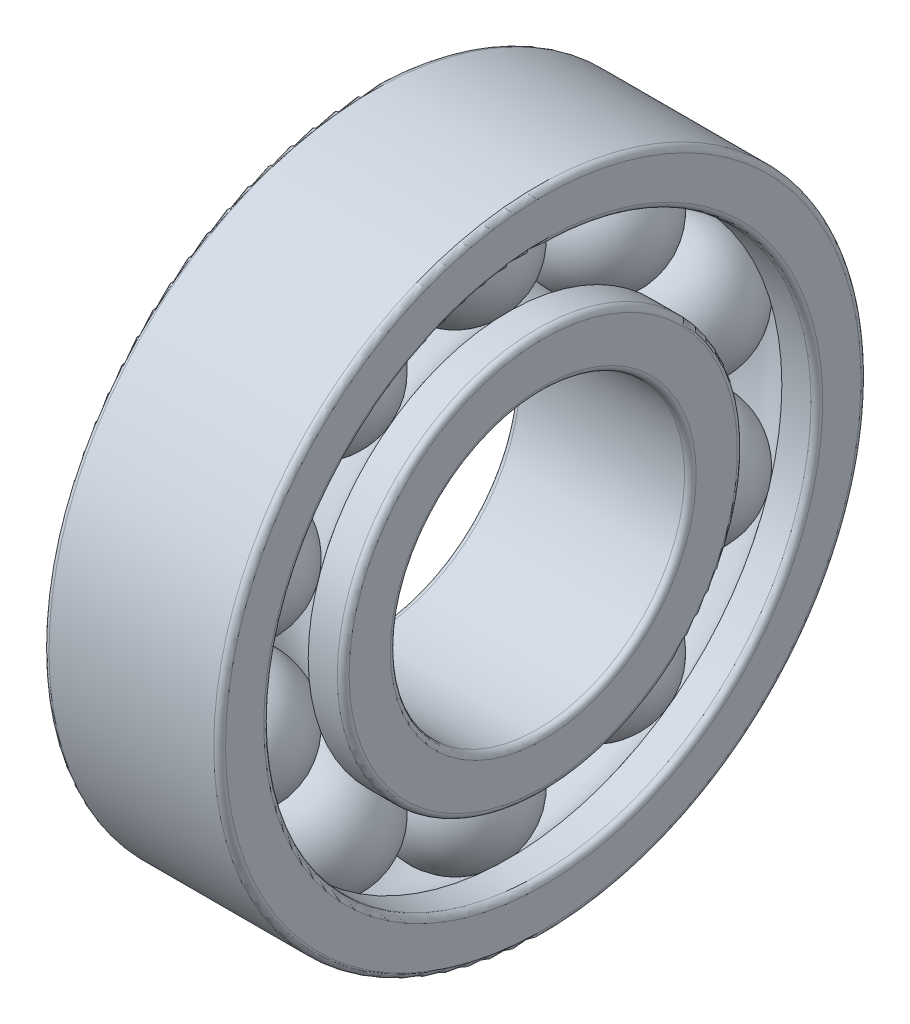
ISO-10303-21;
HEADER;
FILE_DESCRIPTION(('STEP AP214'),'2;1');
FILE_NAME('part.step','',(''),(''),'','','');
FILE_SCHEMA(('AUTOMOTIVE_DESIGN { 1 0 10303 214 1 1 1 1 }'));
ENDSEC;
DATA;
#1=APPLICATION_CONTEXT('core data for automotive mechanical design processes');
#2=APPLICATION_PROTOCOL_DEFINITION('international standard','automotive_design',2000,#1);
#3=PRODUCT_CONTEXT('',#1,'mechanical');
#4=PRODUCT('Part','Part','',(#3));
#5=PRODUCT_RELATED_PRODUCT_CATEGORY('part','',(#4));
#6=PRODUCT_DEFINITION_FORMATION('','',#4);
#7=PRODUCT_DEFINITION_CONTEXT('part definition',#1,'design');
#8=PRODUCT_DEFINITION('design','',#6,#7);
#9=PRODUCT_DEFINITION_SHAPE('','',#8);
#10=(LENGTH_UNIT() NAMED_UNIT(*) SI_UNIT(.MILLI.,.METRE.));
#11=(NAMED_UNIT(*) PLANE_ANGLE_UNIT() SI_UNIT($,.RADIAN.));
#12=(NAMED_UNIT(*) SI_UNIT($,.STERADIAN.) SOLID_ANGLE_UNIT());
#13=UNCERTAINTY_MEASURE_WITH_UNIT(LENGTH_MEASURE(1.E-05),#10,'distance_accuracy_value','');
#14=(GEOMETRIC_REPRESENTATION_CONTEXT(3) GLOBAL_UNCERTAINTY_ASSIGNED_CONTEXT((#13)) GLOBAL_UNIT_ASSIGNED_CONTEXT((#10,
#11,#12)) REPRESENTATION_CONTEXT('',''));
#15=CARTESIAN_POINT('',(0.,0.,0.));
#16=DIRECTION('',(0.,0.,1.));
#17=DIRECTION('',(1.,0.,0.));
#18=AXIS2_PLACEMENT_3D('',#15,#16,#17);
#19=CARTESIAN_POINT('',(0.,3.25629340235919,2.36583564047716));
#20=DIRECTION('',(0.,-0.809016994374955,-0.587785252292462));
#21=DIRECTION('',(-1.,0.,0.));
#22=AXIS2_PLACEMENT_3D('',#19,#20,#21);
#23=SPHERICAL_SURFACE('',#22,1.1);
#24=CARTESIAN_POINT('',(0.,2.36637470854674,1.71927186295545));
#25=VERTEX_POINT('',#24);
#26=VERTEX_LOOP('',#25);
#27=FACE_BOUND('',#26,.T.);
#28=ADVANCED_FACE('F36',(#27),#23,.T.);
#29=CLOSED_SHELL('',(#28));
#30=MANIFOLD_SOLID_BREP('B2',#29);
#31=CARTESIAN_POINT('',(0.,1.24379340235921,3.82800247808798));
#32=DIRECTION('',(0.,-0.309016994374958,-0.95105651629515));
#33=DIRECTION('',(-1.,0.,0.));
#34=AXIS2_PLACEMENT_3D('',#31,#32,#33);
#35=SPHERICAL_SURFACE('',#34,1.1);
#36=CARTESIAN_POINT('',(0.,0.903874708546753,2.78184031016331));
#37=VERTEX_POINT('',#36);
#38=VERTEX_LOOP('',#37);
#39=FACE_BOUND('',#38,.T.);
#40=ADVANCED_FACE('F55',(#39),#35,.T.);
#41=CLOSED_SHELL('',(#40));
#42=MANIFOLD_SOLID_BREP('B6',#41);
#43=CARTESIAN_POINT('',(0.,-1.24379340235913,3.828002478088));
#44=DIRECTION('',(0.,0.309016994374938,-0.951056516295157));
#45=DIRECTION('',(-1.,0.,0.));
#46=AXIS2_PLACEMENT_3D('',#43,#44,#45);
#47=SPHERICAL_SURFACE('',#46,1.1);
#48=CARTESIAN_POINT('',(0.,-0.903874708546694,2.78184031016333));
#49=VERTEX_POINT('',#48);
#50=VERTEX_LOOP('',#49);
#51=FACE_BOUND('',#50,.T.);
#52=ADVANCED_FACE('F74',(#51),#47,.T.);
#53=CLOSED_SHELL('',(#52));
#54=MANIFOLD_SOLID_BREP('B32',#53);
#55=CARTESIAN_POINT('',(0.,-3.25629340235914,2.36583564047723));
#56=DIRECTION('',(0.,0.809016994374942,-0.58778525229248));
#57=DIRECTION('',(-1.,0.,0.));
#58=AXIS2_PLACEMENT_3D('',#55,#56,#57);
#59=SPHERICAL_SURFACE('',#58,1.1);
#60=CARTESIAN_POINT('',(0.,-2.36637470854671,1.7192718629555));
#61=VERTEX_POINT('',#60);
#62=VERTEX_LOOP('',#61);
#63=FACE_BOUND('',#62,.T.);
#64=ADVANCED_FACE('F93',(#63),#59,.T.);
#65=CLOSED_SHELL('',(#64));
#66=MANIFOLD_SOLID_BREP('B51',#65);
#67=CARTESIAN_POINT('',(0.,-4.025,0.));
#68=DIRECTION('',(0.,1.,0.));
#69=DIRECTION('',(-1.,0.,0.));
#70=AXIS2_PLACEMENT_3D('',#67,#68,#69);
#71=SPHERICAL_SURFACE('',#70,1.1);
#72=CARTESIAN_POINT('',(0.,-2.925,0.));
#73=VERTEX_POINT('',#72);
#74=VERTEX_LOOP('',#73);
#75=FACE_BOUND('',#74,.T.);
#76=ADVANCED_FACE('F112',(#75),#71,.T.);
#77=CLOSED_SHELL('',(#76));
#78=MANIFOLD_SOLID_BREP('B70',#77);
#79=CARTESIAN_POINT('',(0.,-3.25629340235918,-2.36583564047719));
#80=DIRECTION('',(0.,0.809016994374951,0.587785252292469));
#81=DIRECTION('',(-1.,0.,0.));
#82=AXIS2_PLACEMENT_3D('',#79,#80,#81);
#83=SPHERICAL_SURFACE('',#82,1.1);
#84=CARTESIAN_POINT('',(0.,-2.36637470854673,-1.71927186295547));
#85=VERTEX_POINT('',#84);
#86=VERTEX_LOOP('',#85);
#87=FACE_BOUND('',#86,.T.);
#88=ADVANCED_FACE('F131',(#87),#83,.T.);
#89=CLOSED_SHELL('',(#88));
#90=MANIFOLD_SOLID_BREP('B89',#89);
#91=CARTESIAN_POINT('',(0.,-1.24379340235918,-3.82800247808799));
#92=DIRECTION('',(0.,0.309016994374952,0.951056516295152));
#93=DIRECTION('',(-1.,0.,0.));
#94=AXIS2_PLACEMENT_3D('',#91,#92,#93);
#95=SPHERICAL_SURFACE('',#94,1.1);
#96=CARTESIAN_POINT('',(0.,-0.903874708546733,-2.78184031016332));
#97=VERTEX_POINT('',#96);
#98=VERTEX_LOOP('',#97);
#99=FACE_BOUND('',#98,.T.);
#100=ADVANCED_FACE('F150',(#99),#95,.T.);
#101=CLOSED_SHELL('',(#100));
#102=MANIFOLD_SOLID_BREP('B108',#101);
#103=CARTESIAN_POINT('',(0.,1.24379340235915,-3.828002478088));
#104=DIRECTION('',(0.,-0.309016994374945,0.951056516295155));
#105=DIRECTION('',(-1.,0.,0.));
#106=AXIS2_PLACEMENT_3D('',#103,#104,#105);
#107=SPHERICAL_SURFACE('',#106,1.1);
#108=CARTESIAN_POINT('',(0.,0.903874708546713,-2.78184031016333));
#109=VERTEX_POINT('',#108);
#110=VERTEX_LOOP('',#109);
#111=FACE_BOUND('',#110,.T.);
#112=ADVANCED_FACE('F169',(#111),#107,.T.);
#113=CLOSED_SHELL('',(#112));
#114=MANIFOLD_SOLID_BREP('B127',#113);
#115=CARTESIAN_POINT('',(0.,3.25629340235916,-2.36583564047721));
#116=DIRECTION('',(0.,-0.809016994374947,0.587785252292474));
#117=DIRECTION('',(-1.,0.,0.));
#118=AXIS2_PLACEMENT_3D('',#115,#116,#117);
#119=SPHERICAL_SURFACE('',#118,1.1);
#120=CARTESIAN_POINT('',(0.,2.36637470854672,-1.71927186295549));
#121=VERTEX_POINT('',#120);
#122=VERTEX_LOOP('',#121);
#123=FACE_BOUND('',#122,.T.);
#124=ADVANCED_FACE('F188',(#123),#119,.T.);
#125=CLOSED_SHELL('',(#124));
#126=MANIFOLD_SOLID_BREP('B146',#125);
#127=CARTESIAN_POINT('',(0.,4.025,0.));
#128=DIRECTION('',(0.,-1.,0.));
#129=DIRECTION('',(-1.,0.,0.));
#130=AXIS2_PLACEMENT_3D('',#127,#128,#129);
#131=SPHERICAL_SURFACE('',#130,1.1);
#132=CARTESIAN_POINT('',(0.,2.925,0.));
#133=VERTEX_POINT('',#132);
#134=VERTEX_LOOP('',#133);
#135=FACE_BOUND('',#134,.T.);
#136=ADVANCED_FACE('F209',(#135),#131,.T.);
#137=CLOSED_SHELL('',(#136));
#138=MANIFOLD_SOLID_BREP('B165',#137);
#139=CARTESIAN_POINT('',(-1.4,0.,0.));
#140=DIRECTION('',(-1.,0.,0.));
#141=DIRECTION('',(0.,0.,1.));
#142=AXIS2_PLACEMENT_3D('',#139,#140,#141);
#143=TOROIDAL_SURFACE('',#142,2.6,0.0999999999999999);
#144=CARTESIAN_POINT('',(-1.4,0.,0.));
#145=DIRECTION('',(-1.,0.,0.));
#146=DIRECTION('',(0.,0.,1.));
#147=AXIS2_PLACEMENT_3D('',#144,#145,#146);
#148=CIRCLE('',#147,2.5);
#149=CARTESIAN_POINT('',(-1.4,0.,2.5));
#150=VERTEX_POINT('',#149);
#151=EDGE_CURVE('E263',#150,#150,#148,.T.);
#152=ORIENTED_EDGE('',*,*,#151,.F.);
#153=EDGE_LOOP('',(#152));
#154=FACE_BOUND('',#153,.T.);
#155=CARTESIAN_POINT('',(-1.5,0.,0.));
#156=DIRECTION('',(-1.,0.,0.));
#157=DIRECTION('',(0.,0.,1.));
#158=AXIS2_PLACEMENT_3D('',#155,#156,#157);
#159=CIRCLE('',#158,2.6);
#160=CARTESIAN_POINT('',(-1.5,0.,2.6));
#161=VERTEX_POINT('',#160);
#162=EDGE_CURVE('E208',#161,#161,#159,.T.);
#163=ORIENTED_EDGE('',*,*,#162,.T.);
#164=EDGE_LOOP('',(#163));
#165=FACE_BOUND('',#164,.T.);
#166=ADVANCED_FACE('F229',(#154,#165),#143,.T.);
#167=CARTESIAN_POINT('',(-1.5,2.6,0.));
#168=DIRECTION('',(1.,0.,0.));
#169=DIRECTION('',(0.,0.,-1.));
#170=AXIS2_PLACEMENT_3D('',#167,#168,#169);
#171=PLANE('',#170);
#172=ORIENTED_EDGE('',*,*,#162,.F.);
#173=EDGE_LOOP('',(#172));
#174=FACE_BOUND('',#173,.T.);
#175=CARTESIAN_POINT('',(-1.5,0.,0.));
#176=DIRECTION('',(-1.,0.,0.));
#177=DIRECTION('',(0.,0.,1.));
#178=AXIS2_PLACEMENT_3D('',#175,#176,#177);
#179=CIRCLE('',#178,3.3);
#180=CARTESIAN_POINT('',(-1.5,0.,3.3));
#181=VERTEX_POINT('',#180);
#182=EDGE_CURVE('E235',#181,#181,#179,.T.);
#183=ORIENTED_EDGE('',*,*,#182,.T.);
#184=EDGE_LOOP('',(#183));
#185=FACE_BOUND('',#184,.T.);
#186=ADVANCED_FACE('F270',(#174,#185),#171,.F.);
#187=CARTESIAN_POINT('',(-1.4,0.,0.));
#188=DIRECTION('',(-1.,0.,0.));
#189=DIRECTION('',(0.,0.,1.));
#190=AXIS2_PLACEMENT_3D('',#187,#188,#189);
#191=TOROIDAL_SURFACE('',#190,3.3,0.0999999999999999);
#192=ORIENTED_EDGE('',*,*,#182,.F.);
#193=EDGE_LOOP('',(#192));
#194=FACE_BOUND('',#193,.T.);
#195=CARTESIAN_POINT('',(-1.4,0.,0.));
#196=DIRECTION('',(-1.,0.,0.));
#197=DIRECTION('',(0.,0.,1.));
#198=AXIS2_PLACEMENT_3D('',#195,#196,#197);
#199=CIRCLE('',#198,3.4);
#200=CARTESIAN_POINT('',(-1.4,0.,3.4));
#201=VERTEX_POINT('',#200);
#202=EDGE_CURVE('E239',#201,#201,#199,.T.);
#203=ORIENTED_EDGE('',*,*,#202,.T.);
#204=EDGE_LOOP('',(#203));
#205=FACE_BOUND('',#204,.T.);
#206=ADVANCED_FACE('F274',(#194,#205),#191,.T.);
#207=CARTESIAN_POINT('',(-11.0577427821522,0.,0.));
#208=DIRECTION('',(-1.,0.,0.));
#209=DIRECTION('',(0.,0.,1.));
#210=AXIS2_PLACEMENT_3D('',#207,#208,#209);
#211=CYLINDRICAL_SURFACE('',#210,3.4);
#212=ORIENTED_EDGE('',*,*,#202,.F.);
#213=EDGE_LOOP('',(#212));
#214=FACE_BOUND('',#213,.T.);
#215=CARTESIAN_POINT('',(-0.905193349511583,0.,0.));
#216=DIRECTION('',(-1.,0.,0.));
#217=DIRECTION('',(0.,0.,1.));
#218=AXIS2_PLACEMENT_3D('',#215,#216,#217);
#219=CIRCLE('',#218,3.4);
#220=CARTESIAN_POINT('',(-0.905193349511583,0.,3.4));
#221=VERTEX_POINT('',#220);
#222=EDGE_CURVE('E243',#221,#221,#219,.T.);
#223=ORIENTED_EDGE('',*,*,#222,.T.);
#224=EDGE_LOOP('',(#223));
#225=FACE_BOUND('',#224,.T.);
#226=ADVANCED_FACE('F279',(#214,#225),#211,.T.);
#227=CARTESIAN_POINT('',(0.,0.,0.));
#228=DIRECTION('',(-1.,0.,0.));
#229=DIRECTION('',(0.,0.,1.));
#230=AXIS2_PLACEMENT_3D('',#227,#228,#229);
#231=TOROIDAL_SURFACE('',#230,4.025,1.1);
#232=ORIENTED_EDGE('',*,*,#222,.F.);
#233=EDGE_LOOP('',(#232));
#234=FACE_BOUND('',#233,.T.);
#235=CARTESIAN_POINT('',(0.905193349511583,0.,0.));
#236=DIRECTION('',(-1.,0.,0.));
#237=DIRECTION('',(0.,0.,1.));
#238=AXIS2_PLACEMENT_3D('',#235,#236,#237);
#239=CIRCLE('',#238,3.4);
#240=CARTESIAN_POINT('',(0.905193349511583,0.,3.4));
#241=VERTEX_POINT('',#240);
#242=EDGE_CURVE('E248',#241,#241,#239,.T.);
#243=ORIENTED_EDGE('',*,*,#242,.T.);
#244=EDGE_LOOP('',(#243));
#245=FACE_BOUND('',#244,.T.);
#246=ADVANCED_FACE('F285',(#234,#245),#231,.F.);
#247=CARTESIAN_POINT('',(-11.0577427821522,0.,0.));
#248=DIRECTION('',(-1.,0.,0.));
#249=DIRECTION('',(0.,0.,1.));
#250=AXIS2_PLACEMENT_3D('',#247,#248,#249);
#251=CYLINDRICAL_SURFACE('',#250,3.4);
#252=ORIENTED_EDGE('',*,*,#242,.F.);
#253=EDGE_LOOP('',(#252));
#254=FACE_BOUND('',#253,.T.);
#255=CARTESIAN_POINT('',(1.4,0.,0.));
#256=DIRECTION('',(-1.,0.,0.));
#257=DIRECTION('',(0.,0.,1.));
#258=AXIS2_PLACEMENT_3D('',#255,#256,#257);
#259=CIRCLE('',#258,3.4);
#260=CARTESIAN_POINT('',(1.4,0.,3.4));
#261=VERTEX_POINT('',#260);
#262=EDGE_CURVE('E251',#261,#261,#259,.T.);
#263=ORIENTED_EDGE('',*,*,#262,.T.);
#264=EDGE_LOOP('',(#263));
#265=FACE_BOUND('',#264,.T.);
#266=ADVANCED_FACE('F289',(#254,#265),#251,.T.);
#267=CARTESIAN_POINT('',(1.4,0.,0.));
#268=DIRECTION('',(-1.,0.,0.));
#269=DIRECTION('',(0.,0.,1.));
#270=AXIS2_PLACEMENT_3D('',#267,#268,#269);
#271=TOROIDAL_SURFACE('',#270,3.3,0.0999999999999999);
#272=ORIENTED_EDGE('',*,*,#262,.F.);
#273=EDGE_LOOP('',(#272));
#274=FACE_BOUND('',#273,.T.);
#275=CARTESIAN_POINT('',(1.5,0.,0.));
#276=DIRECTION('',(-1.,0.,0.));
#277=DIRECTION('',(0.,0.,1.));
#278=AXIS2_PLACEMENT_3D('',#275,#276,#277);
#279=CIRCLE('',#278,3.3);
#280=CARTESIAN_POINT('',(1.5,0.,3.3));
#281=VERTEX_POINT('',#280);
#282=EDGE_CURVE('E254',#281,#281,#279,.T.);
#283=ORIENTED_EDGE('',*,*,#282,.T.);
#284=EDGE_LOOP('',(#283));
#285=FACE_BOUND('',#284,.T.);
#286=ADVANCED_FACE('F293',(#274,#285),#271,.T.);
#287=CARTESIAN_POINT('',(1.5,2.6,0.));
#288=DIRECTION('',(-1.,0.,0.));
#289=DIRECTION('',(0.,0.,1.));
#290=AXIS2_PLACEMENT_3D('',#287,#288,#289);
#291=PLANE('',#290);
#292=ORIENTED_EDGE('',*,*,#282,.F.);
#293=EDGE_LOOP('',(#292));
#294=FACE_BOUND('',#293,.T.);
#295=CARTESIAN_POINT('',(1.5,0.,0.));
#296=DIRECTION('',(-1.,0.,0.));
#297=DIRECTION('',(0.,0.,1.));
#298=AXIS2_PLACEMENT_3D('',#295,#296,#297);
#299=CIRCLE('',#298,2.6);
#300=CARTESIAN_POINT('',(1.5,0.,2.6));
#301=VERTEX_POINT('',#300);
#302=EDGE_CURVE('E257',#301,#301,#299,.T.);
#303=ORIENTED_EDGE('',*,*,#302,.T.);
#304=EDGE_LOOP('',(#303));
#305=FACE_BOUND('',#304,.T.);
#306=ADVANCED_FACE('F297',(#294,#305),#291,.F.);
#307=CARTESIAN_POINT('',(1.4,0.,0.));
#308=DIRECTION('',(-1.,0.,0.));
#309=DIRECTION('',(0.,0.,1.));
#310=AXIS2_PLACEMENT_3D('',#307,#308,#309);
#311=TOROIDAL_SURFACE('',#310,2.6,0.0999999999999999);
#312=ORIENTED_EDGE('',*,*,#302,.F.);
#313=EDGE_LOOP('',(#312));
#314=FACE_BOUND('',#313,.T.);
#315=CARTESIAN_POINT('',(1.4,0.,0.));
#316=DIRECTION('',(-1.,0.,0.));
#317=DIRECTION('',(0.,0.,1.));
#318=AXIS2_PLACEMENT_3D('',#315,#316,#317);
#319=CIRCLE('',#318,2.5);
#320=CARTESIAN_POINT('',(1.4,0.,2.5));
#321=VERTEX_POINT('',#320);
#322=EDGE_CURVE('E260',#321,#321,#319,.T.);
#323=ORIENTED_EDGE('',*,*,#322,.T.);
#324=EDGE_LOOP('',(#323));
#325=FACE_BOUND('',#324,.T.);
#326=ADVANCED_FACE('F301',(#314,#325),#311,.T.);
#327=CARTESIAN_POINT('',(-11.0577427821522,0.,0.));
#328=DIRECTION('',(-1.,0.,0.));
#329=DIRECTION('',(0.,0.,1.));
#330=AXIS2_PLACEMENT_3D('',#327,#328,#329);
#331=CYLINDRICAL_SURFACE('',#330,2.5);
#332=ORIENTED_EDGE('',*,*,#322,.F.);
#333=EDGE_LOOP('',(#332));
#334=FACE_BOUND('',#333,.T.);
#335=ORIENTED_EDGE('',*,*,#151,.T.);
#336=EDGE_LOOP('',(#335));
#337=FACE_BOUND('',#336,.T.);
#338=ADVANCED_FACE('F267',(#334,#337),#331,.F.);
#339=CLOSED_SHELL('',(#166,#186,#206,#226,#246,#266,#286,#306,#326,#338));
#340=MANIFOLD_SOLID_BREP('B184',#339);
#341=CARTESIAN_POINT('',(-1.4,0.,0.));
#342=DIRECTION('',(-1.,0.,0.));
#343=DIRECTION('',(0.,0.,1.));
#344=AXIS2_PLACEMENT_3D('',#341,#342,#343);
#345=TOROIDAL_SURFACE('',#344,4.75,0.1);
#346=CARTESIAN_POINT('',(-1.4,0.,0.));
#347=DIRECTION('',(-1.,0.,0.));
#348=DIRECTION('',(0.,0.,1.));
#349=AXIS2_PLACEMENT_3D('',#346,#347,#348);
#350=CIRCLE('',#349,4.65);
#351=CARTESIAN_POINT('',(-1.4,0.,4.65));
#352=VERTEX_POINT('',#351);
#353=EDGE_CURVE('E409',#352,#352,#350,.T.);
#354=ORIENTED_EDGE('',*,*,#353,.F.);
#355=EDGE_LOOP('',(#354));
#356=FACE_BOUND('',#355,.T.);
#357=CARTESIAN_POINT('',(-1.5,0.,0.));
#358=DIRECTION('',(-1.,0.,0.));
#359=DIRECTION('',(0.,0.,1.));
#360=AXIS2_PLACEMENT_3D('',#357,#358,#359);
#361=CIRCLE('',#360,4.75);
#362=CARTESIAN_POINT('',(-1.5,0.,4.75));
#363=VERTEX_POINT('',#362);
#364=EDGE_CURVE('E228',#363,#363,#361,.T.);
#365=ORIENTED_EDGE('',*,*,#364,.T.);
#366=EDGE_LOOP('',(#365));
#367=FACE_BOUND('',#366,.T.);
#368=ADVANCED_FACE('F375',(#356,#367),#345,.T.);
#369=CARTESIAN_POINT('',(-1.5,4.75,0.));
#370=DIRECTION('',(1.,0.,0.));
#371=DIRECTION('',(0.,0.,-1.));
#372=AXIS2_PLACEMENT_3D('',#369,#370,#371);
#373=PLANE('',#372);
#374=ORIENTED_EDGE('',*,*,#364,.F.);
#375=EDGE_LOOP('',(#374));
#376=FACE_BOUND('',#375,.T.);
#377=CARTESIAN_POINT('',(-1.5,0.,0.));
#378=DIRECTION('',(-1.,0.,0.));
#379=DIRECTION('',(0.,0.,1.));
#380=AXIS2_PLACEMENT_3D('',#377,#378,#379);
#381=CIRCLE('',#380,5.4);
#382=CARTESIAN_POINT('',(-1.5,0.,5.4));
#383=VERTEX_POINT('',#382);
#384=EDGE_CURVE('E381',#383,#383,#381,.T.);
#385=ORIENTED_EDGE('',*,*,#384,.T.);
#386=EDGE_LOOP('',(#385));
#387=FACE_BOUND('',#386,.T.);
#388=ADVANCED_FACE('F416',(#376,#387),#373,.F.);
#389=CARTESIAN_POINT('',(-1.4,0.,0.));
#390=DIRECTION('',(-1.,0.,0.));
#391=DIRECTION('',(0.,0.,1.));
#392=AXIS2_PLACEMENT_3D('',#389,#390,#391);
#393=TOROIDAL_SURFACE('',#392,5.4,0.1);
#394=ORIENTED_EDGE('',*,*,#384,.F.);
#395=EDGE_LOOP('',(#394));
#396=FACE_BOUND('',#395,.T.);
#397=CARTESIAN_POINT('',(-1.4,0.,0.));
#398=DIRECTION('',(-1.,0.,0.));
#399=DIRECTION('',(0.,0.,1.));
#400=AXIS2_PLACEMENT_3D('',#397,#398,#399);
#401=CIRCLE('',#400,5.5);
#402=CARTESIAN_POINT('',(-1.4,0.,5.5));
#403=VERTEX_POINT('',#402);
#404=EDGE_CURVE('E385',#403,#403,#401,.T.);
#405=ORIENTED_EDGE('',*,*,#404,.T.);
#406=EDGE_LOOP('',(#405));
#407=FACE_BOUND('',#406,.T.);
#408=ADVANCED_FACE('F420',(#396,#407),#393,.T.);
#409=CARTESIAN_POINT('',(-11.0577427821522,0.,0.));
#410=DIRECTION('',(-1.,0.,0.));
#411=DIRECTION('',(0.,0.,1.));
#412=AXIS2_PLACEMENT_3D('',#409,#410,#411);
#413=CYLINDRICAL_SURFACE('',#412,5.5);
#414=ORIENTED_EDGE('',*,*,#404,.F.);
#415=EDGE_LOOP('',(#414));
#416=FACE_BOUND('',#415,.T.);
#417=CARTESIAN_POINT('',(1.4,0.,0.));
#418=DIRECTION('',(-1.,0.,0.));
#419=DIRECTION('',(0.,0.,1.));
#420=AXIS2_PLACEMENT_3D('',#417,#418,#419);
#421=CIRCLE('',#420,5.5);
#422=CARTESIAN_POINT('',(1.4,0.,5.5));
#423=VERTEX_POINT('',#422);
#424=EDGE_CURVE('E389',#423,#423,#421,.T.);
#425=ORIENTED_EDGE('',*,*,#424,.T.);
#426=EDGE_LOOP('',(#425));
#427=FACE_BOUND('',#426,.T.);
#428=ADVANCED_FACE('F425',(#416,#427),#413,.T.);
#429=CARTESIAN_POINT('',(1.4,0.,0.));
#430=DIRECTION('',(-1.,0.,0.));
#431=DIRECTION('',(0.,0.,1.));
#432=AXIS2_PLACEMENT_3D('',#429,#430,#431);
#433=TOROIDAL_SURFACE('',#432,5.4,0.1);
#434=ORIENTED_EDGE('',*,*,#424,.F.);
#435=EDGE_LOOP('',(#434));
#436=FACE_BOUND('',#435,.T.);
#437=CARTESIAN_POINT('',(1.5,0.,0.));
#438=DIRECTION('',(-1.,0.,0.));
#439=DIRECTION('',(0.,0.,1.));
#440=AXIS2_PLACEMENT_3D('',#437,#438,#439);
#441=CIRCLE('',#440,5.4);
#442=CARTESIAN_POINT('',(1.5,0.,5.4));
#443=VERTEX_POINT('',#442);
#444=EDGE_CURVE('E394',#443,#443,#441,.T.);
#445=ORIENTED_EDGE('',*,*,#444,.T.);
#446=EDGE_LOOP('',(#445));
#447=FACE_BOUND('',#446,.T.);
#448=ADVANCED_FACE('F431',(#436,#447),#433,.T.);
#449=CARTESIAN_POINT('',(1.5,4.75,0.));
#450=DIRECTION('',(-1.,0.,0.));
#451=DIRECTION('',(0.,0.,1.));
#452=AXIS2_PLACEMENT_3D('',#449,#450,#451);
#453=PLANE('',#452);
#454=ORIENTED_EDGE('',*,*,#444,.F.);
#455=EDGE_LOOP('',(#454));
#456=FACE_BOUND('',#455,.T.);
#457=CARTESIAN_POINT('',(1.5,0.,0.));
#458=DIRECTION('',(-1.,0.,0.));
#459=DIRECTION('',(0.,0.,1.));
#460=AXIS2_PLACEMENT_3D('',#457,#458,#459);
#461=CIRCLE('',#460,4.75);
#462=CARTESIAN_POINT('',(1.5,0.,4.75));
#463=VERTEX_POINT('',#462);
#464=EDGE_CURVE('E397',#463,#463,#461,.T.);
#465=ORIENTED_EDGE('',*,*,#464,.T.);
#466=EDGE_LOOP('',(#465));
#467=FACE_BOUND('',#466,.T.);
#468=ADVANCED_FACE('F435',(#456,#467),#453,.F.);
#469=CARTESIAN_POINT('',(1.4,0.,0.));
#470=DIRECTION('',(-1.,0.,0.));
#471=DIRECTION('',(0.,0.,1.));
#472=AXIS2_PLACEMENT_3D('',#469,#470,#471);
#473=TOROIDAL_SURFACE('',#472,4.75,0.1);
#474=ORIENTED_EDGE('',*,*,#464,.F.);
#475=EDGE_LOOP('',(#474));
#476=FACE_BOUND('',#475,.T.);
#477=CARTESIAN_POINT('',(1.4,0.,0.));
#478=DIRECTION('',(-1.,0.,0.));
#479=DIRECTION('',(0.,0.,1.));
#480=AXIS2_PLACEMENT_3D('',#477,#478,#479);
#481=CIRCLE('',#480,4.65);
#482=CARTESIAN_POINT('',(1.4,0.,4.65));
#483=VERTEX_POINT('',#482);
#484=EDGE_CURVE('E400',#483,#483,#481,.T.);
#485=ORIENTED_EDGE('',*,*,#484,.T.);
#486=EDGE_LOOP('',(#485));
#487=FACE_BOUND('',#486,.T.);
#488=ADVANCED_FACE('F439',(#476,#487),#473,.T.);
#489=CARTESIAN_POINT('',(-11.0577427821522,0.,0.));
#490=DIRECTION('',(-1.,0.,0.));
#491=DIRECTION('',(0.,0.,1.));
#492=AXIS2_PLACEMENT_3D('',#489,#490,#491);
#493=CYLINDRICAL_SURFACE('',#492,4.65);
#494=ORIENTED_EDGE('',*,*,#484,.F.);
#495=EDGE_LOOP('',(#494));
#496=FACE_BOUND('',#495,.T.);
#497=CARTESIAN_POINT('',(0.905193349511583,0.,0.));
#498=DIRECTION('',(-1.,0.,0.));
#499=DIRECTION('',(0.,0.,1.));
#500=AXIS2_PLACEMENT_3D('',#497,#498,#499);
#501=CIRCLE('',#500,4.65);
#502=CARTESIAN_POINT('',(0.905193349511583,0.,4.65));
#503=VERTEX_POINT('',#502);
#504=EDGE_CURVE('E403',#503,#503,#501,.T.);
#505=ORIENTED_EDGE('',*,*,#504,.T.);
#506=EDGE_LOOP('',(#505));
#507=FACE_BOUND('',#506,.T.);
#508=ADVANCED_FACE('F443',(#496,#507),#493,.F.);
#509=CARTESIAN_POINT('',(0.,0.,0.));
#510=DIRECTION('',(-1.,0.,0.));
#511=DIRECTION('',(0.,0.,1.));
#512=AXIS2_PLACEMENT_3D('',#509,#510,#511);
#513=TOROIDAL_SURFACE('',#512,4.025,1.1);
#514=ORIENTED_EDGE('',*,*,#504,.F.);
#515=EDGE_LOOP('',(#514));
#516=FACE_BOUND('',#515,.T.);
#517=CARTESIAN_POINT('',(-0.905193349511583,0.,0.));
#518=DIRECTION('',(-1.,0.,0.));
#519=DIRECTION('',(0.,0.,1.));
#520=AXIS2_PLACEMENT_3D('',#517,#518,#519);
#521=CIRCLE('',#520,4.65);
#522=CARTESIAN_POINT('',(-0.905193349511583,0.,4.65));
#523=VERTEX_POINT('',#522);
#524=EDGE_CURVE('E406',#523,#523,#521,.T.);
#525=ORIENTED_EDGE('',*,*,#524,.T.);
#526=EDGE_LOOP('',(#525));
#527=FACE_BOUND('',#526,.T.);
#528=ADVANCED_FACE('F447',(#516,#527),#513,.F.);
#529=CARTESIAN_POINT('',(-11.0577427821522,0.,0.));
#530=DIRECTION('',(-1.,0.,0.));
#531=DIRECTION('',(0.,0.,1.));
#532=AXIS2_PLACEMENT_3D('',#529,#530,#531);
#533=CYLINDRICAL_SURFACE('',#532,4.65);
#534=ORIENTED_EDGE('',*,*,#524,.F.);
#535=EDGE_LOOP('',(#534));
#536=FACE_BOUND('',#535,.T.);
#537=ORIENTED_EDGE('',*,*,#353,.T.);
#538=EDGE_LOOP('',(#537));
#539=FACE_BOUND('',#538,.T.);
#540=ADVANCED_FACE('F413',(#536,#539),#533,.F.);
#541=CLOSED_SHELL('',(#368,#388,#408,#428,#448,#468,#488,#508,#528,#540));
#542=MANIFOLD_SOLID_BREP('B203',#541);
#543=ADVANCED_BREP_SHAPE_REPRESENTATION('',(#18,#30,#42,#54,#66,#78,#90,#102,#114,#126,#138,
#340,#542),#14);
#544=SHAPE_DEFINITION_REPRESENTATION(#9,#543);
ENDSEC;
END-ISO-10303-21;
